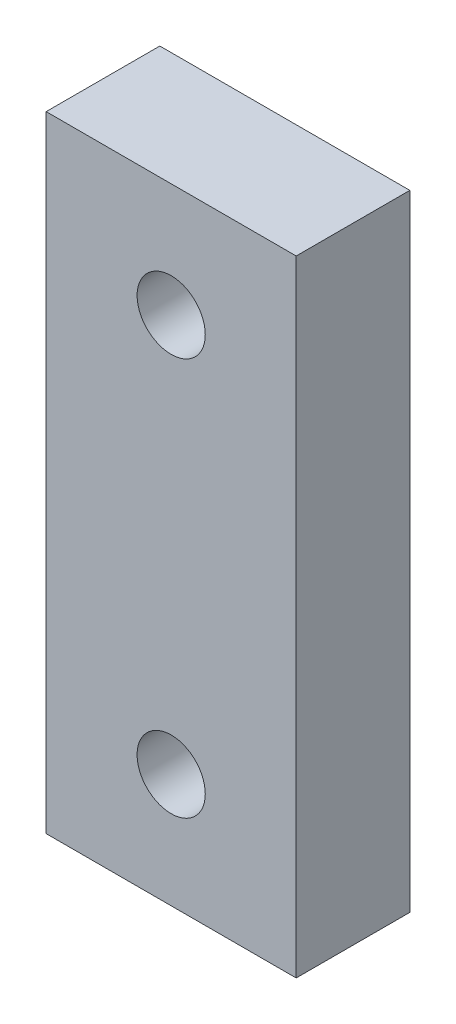
ISO-10303-21;
HEADER;
FILE_DESCRIPTION(('STEP AP214'),'2;1');
FILE_NAME('part.step','',(''),(''),'','','');
FILE_SCHEMA(('AUTOMOTIVE_DESIGN { 1 0 10303 214 1 1 1 1 }'));
ENDSEC;
DATA;
#1=APPLICATION_CONTEXT('core data for automotive mechanical design processes');
#2=APPLICATION_PROTOCOL_DEFINITION('international standard','automotive_design',2000,#1);
#3=PRODUCT_CONTEXT('',#1,'mechanical');
#4=PRODUCT('Part','Part','',(#3));
#5=PRODUCT_RELATED_PRODUCT_CATEGORY('part','',(#4));
#6=PRODUCT_DEFINITION_FORMATION('','',#4);
#7=PRODUCT_DEFINITION_CONTEXT('part definition',#1,'design');
#8=PRODUCT_DEFINITION('design','',#6,#7);
#9=PRODUCT_DEFINITION_SHAPE('','',#8);
#10=(LENGTH_UNIT() NAMED_UNIT(*) SI_UNIT(.MILLI.,.METRE.));
#11=(NAMED_UNIT(*) PLANE_ANGLE_UNIT() SI_UNIT($,.RADIAN.));
#12=(NAMED_UNIT(*) SI_UNIT($,.STERADIAN.) SOLID_ANGLE_UNIT());
#13=UNCERTAINTY_MEASURE_WITH_UNIT(LENGTH_MEASURE(1.E-05),#10,'distance_accuracy_value','');
#14=(GEOMETRIC_REPRESENTATION_CONTEXT(3) GLOBAL_UNCERTAINTY_ASSIGNED_CONTEXT((#13)) GLOBAL_UNIT_ASSIGNED_CONTEXT((#10,
#11,#12)) REPRESENTATION_CONTEXT('',''));
#15=CARTESIAN_POINT('',(0.,0.,0.));
#16=DIRECTION('',(0.,0.,1.));
#17=DIRECTION('',(1.,0.,0.));
#18=AXIS2_PLACEMENT_3D('',#15,#16,#17);
#19=CARTESIAN_POINT('',(5.5,13.755,5.));
#20=DIRECTION('',(-1.,0.,0.));
#21=DIRECTION('',(0.,-1.,0.));
#22=AXIS2_PLACEMENT_3D('',#19,#20,#21);
#23=PLANE('',#22);
#24=DIRECTION('',(0.,1.,0.));
#25=VECTOR('',#24,1.);
#26=CARTESIAN_POINT('',(5.5,13.755,0.));
#27=LINE('',#26,#25);
#28=CARTESIAN_POINT('',(5.5,-13.755,0.));
#29=VERTEX_POINT('',#28);
#30=CARTESIAN_POINT('',(5.5,13.755,0.));
#31=VERTEX_POINT('',#30);
#32=EDGE_CURVE('E96',#29,#31,#27,.T.);
#33=ORIENTED_EDGE('',*,*,#32,.T.);
#34=DIRECTION('',(0.,0.,-1.));
#35=VECTOR('',#34,1.);
#36=CARTESIAN_POINT('',(5.5,13.755,5.));
#37=LINE('',#36,#35);
#38=CARTESIAN_POINT('',(5.5,13.755,5.));
#39=VERTEX_POINT('',#38);
#40=EDGE_CURVE('E11',#39,#31,#37,.T.);
#41=ORIENTED_EDGE('',*,*,#40,.F.);
#42=DIRECTION('',(0.,1.,0.));
#43=VECTOR('',#42,1.);
#44=CARTESIAN_POINT('',(5.5,13.755,5.));
#45=LINE('',#44,#43);
#46=CARTESIAN_POINT('',(5.5,-13.755,5.));
#47=VERTEX_POINT('',#46);
#48=EDGE_CURVE('E84',#47,#39,#45,.T.);
#49=ORIENTED_EDGE('',*,*,#48,.F.);
#50=DIRECTION('',(0.,0.,-1.));
#51=VECTOR('',#50,1.);
#52=CARTESIAN_POINT('',(5.5,-13.755,5.));
#53=LINE('',#52,#51);
#54=EDGE_CURVE('E92',#47,#29,#53,.T.);
#55=ORIENTED_EDGE('',*,*,#54,.T.);
#56=EDGE_LOOP('',(#33,#41,#49,#55));
#57=FACE_BOUND('',#56,.T.);
#58=ADVANCED_FACE('F33',(#57),#23,.F.);
#59=CARTESIAN_POINT('',(-5.5,13.755,5.));
#60=DIRECTION('',(0.,-1.,0.));
#61=DIRECTION('',(0.,0.,-1.));
#62=AXIS2_PLACEMENT_3D('',#59,#60,#61);
#63=PLANE('',#62);
#64=DIRECTION('',(-1.,0.,0.));
#65=VECTOR('',#64,1.);
#66=CARTESIAN_POINT('',(-5.5,13.755,0.));
#67=LINE('',#66,#65);
#68=CARTESIAN_POINT('',(-5.5,13.755,0.));
#69=VERTEX_POINT('',#68);
#70=EDGE_CURVE('E88',#31,#69,#67,.T.);
#71=ORIENTED_EDGE('',*,*,#70,.T.);
#72=DIRECTION('',(0.,0.,-1.));
#73=VECTOR('',#72,1.);
#74=CARTESIAN_POINT('',(-5.5,13.755,5.));
#75=LINE('',#74,#73);
#76=CARTESIAN_POINT('',(-5.5,13.755,5.));
#77=VERTEX_POINT('',#76);
#78=EDGE_CURVE('E41',#77,#69,#75,.T.);
#79=ORIENTED_EDGE('',*,*,#78,.F.);
#80=DIRECTION('',(-1.,0.,0.));
#81=VECTOR('',#80,1.);
#82=CARTESIAN_POINT('',(-5.5,13.755,5.));
#83=LINE('',#82,#81);
#84=EDGE_CURVE('E79',#39,#77,#83,.T.);
#85=ORIENTED_EDGE('',*,*,#84,.F.);
#86=ORIENTED_EDGE('',*,*,#40,.T.);
#87=EDGE_LOOP('',(#71,#79,#85,#86));
#88=FACE_BOUND('',#87,.T.);
#89=ADVANCED_FACE('F87',(#88),#63,.F.);
#90=CARTESIAN_POINT('',(-5.5,13.755,5.));
#91=DIRECTION('',(1.,0.,0.));
#92=DIRECTION('',(0.,1.,0.));
#93=AXIS2_PLACEMENT_3D('',#90,#91,#92);
#94=PLANE('',#93);
#95=DIRECTION('',(0.,-1.,0.));
#96=VECTOR('',#95,1.);
#97=CARTESIAN_POINT('',(-5.5,13.755,0.));
#98=LINE('',#97,#96);
#99=CARTESIAN_POINT('',(-5.5,-13.755,0.));
#100=VERTEX_POINT('',#99);
#101=EDGE_CURVE('E66',#69,#100,#98,.T.);
#102=ORIENTED_EDGE('',*,*,#101,.T.);
#103=DIRECTION('',(0.,0.,-1.));
#104=VECTOR('',#103,1.);
#105=CARTESIAN_POINT('',(-5.5,-13.755,5.));
#106=LINE('',#105,#104);
#107=CARTESIAN_POINT('',(-5.5,-13.755,5.));
#108=VERTEX_POINT('',#107);
#109=EDGE_CURVE('E89',#108,#100,#106,.T.);
#110=ORIENTED_EDGE('',*,*,#109,.F.);
#111=DIRECTION('',(0.,-1.,0.));
#112=VECTOR('',#111,1.);
#113=CARTESIAN_POINT('',(-5.5,13.755,5.));
#114=LINE('',#113,#112);
#115=EDGE_CURVE('E82',#77,#108,#114,.T.);
#116=ORIENTED_EDGE('',*,*,#115,.F.);
#117=ORIENTED_EDGE('',*,*,#78,.T.);
#118=EDGE_LOOP('',(#102,#110,#116,#117));
#119=FACE_BOUND('',#118,.T.);
#120=ADVANCED_FACE('F90',(#119),#94,.F.);
#121=CARTESIAN_POINT('',(-5.5,-13.755,5.));
#122=DIRECTION('',(0.,1.,0.));
#123=DIRECTION('',(0.,0.,1.));
#124=AXIS2_PLACEMENT_3D('',#121,#122,#123);
#125=PLANE('',#124);
#126=DIRECTION('',(1.,0.,0.));
#127=VECTOR('',#126,1.);
#128=CARTESIAN_POINT('',(-5.5,-13.755,0.));
#129=LINE('',#128,#127);
#130=EDGE_CURVE('E72',#100,#29,#129,.T.);
#131=ORIENTED_EDGE('',*,*,#130,.T.);
#132=ORIENTED_EDGE('',*,*,#54,.F.);
#133=DIRECTION('',(1.,0.,0.));
#134=VECTOR('',#133,1.);
#135=CARTESIAN_POINT('',(-5.5,-13.755,5.));
#136=LINE('',#135,#134);
#137=EDGE_CURVE('E49',#108,#47,#136,.T.);
#138=ORIENTED_EDGE('',*,*,#137,.F.);
#139=ORIENTED_EDGE('',*,*,#109,.T.);
#140=EDGE_LOOP('',(#131,#132,#138,#139));
#141=FACE_BOUND('',#140,.T.);
#142=ADVANCED_FACE('F104',(#141),#125,.F.);
#143=CARTESIAN_POINT('',(0.,0.,5.));
#144=DIRECTION('',(0.,0.,1.));
#145=DIRECTION('',(1.,0.,0.));
#146=AXIS2_PLACEMENT_3D('',#143,#144,#145);
#147=PLANE('',#146);
#148=CARTESIAN_POINT('',(0.,8.755,5.));
#149=DIRECTION('',(0.,0.,1.));
#150=DIRECTION('',(1.,0.,0.));
#151=AXIS2_PLACEMENT_3D('',#148,#149,#150);
#152=CIRCLE('',#151,1.5);
#153=CARTESIAN_POINT('',(1.5,8.755,5.));
#154=VERTEX_POINT('',#153);
#155=EDGE_CURVE('E99',#154,#154,#152,.T.);
#156=ORIENTED_EDGE('',*,*,#155,.F.);
#157=EDGE_LOOP('',(#156));
#158=FACE_BOUND('',#157,.T.);
#159=CARTESIAN_POINT('',(0.,-8.745,5.));
#160=DIRECTION('',(0.,0.,1.));
#161=DIRECTION('',(1.,0.,0.));
#162=AXIS2_PLACEMENT_3D('',#159,#160,#161);
#163=CIRCLE('',#162,1.5);
#164=CARTESIAN_POINT('',(1.5,-8.745,5.));
#165=VERTEX_POINT('',#164);
#166=EDGE_CURVE('E112',#165,#165,#163,.T.);
#167=ORIENTED_EDGE('',*,*,#166,.F.);
#168=EDGE_LOOP('',(#167));
#169=FACE_BOUND('',#168,.T.);
#170=ORIENTED_EDGE('',*,*,#48,.T.);
#171=ORIENTED_EDGE('',*,*,#84,.T.);
#172=ORIENTED_EDGE('',*,*,#115,.T.);
#173=ORIENTED_EDGE('',*,*,#137,.T.);
#174=EDGE_LOOP('',(#170,#171,#172,#173));
#175=FACE_BOUND('',#174,.T.);
#176=ADVANCED_FACE('F80',(#158,#169,#175),#147,.T.);
#177=CARTESIAN_POINT('',(0.,0.,0.));
#178=DIRECTION('',(0.,0.,1.));
#179=DIRECTION('',(1.,0.,0.));
#180=AXIS2_PLACEMENT_3D('',#177,#178,#179);
#181=PLANE('',#180);
#182=CARTESIAN_POINT('',(0.,8.755,0.));
#183=DIRECTION('',(0.,0.,-1.));
#184=DIRECTION('',(-1.,0.,0.));
#185=AXIS2_PLACEMENT_3D('',#182,#183,#184);
#186=CIRCLE('',#185,1.5);
#187=CARTESIAN_POINT('',(-1.5,8.755,0.));
#188=VERTEX_POINT('',#187);
#189=EDGE_CURVE('E115',#188,#188,#186,.T.);
#190=ORIENTED_EDGE('',*,*,#189,.F.);
#191=EDGE_LOOP('',(#190));
#192=FACE_BOUND('',#191,.T.);
#193=CARTESIAN_POINT('',(0.,-8.745,0.));
#194=DIRECTION('',(0.,0.,-1.));
#195=DIRECTION('',(-1.,0.,0.));
#196=AXIS2_PLACEMENT_3D('',#193,#194,#195);
#197=CIRCLE('',#196,1.5);
#198=CARTESIAN_POINT('',(-1.5,-8.745,0.));
#199=VERTEX_POINT('',#198);
#200=EDGE_CURVE('E116',#199,#199,#197,.T.);
#201=ORIENTED_EDGE('',*,*,#200,.F.);
#202=EDGE_LOOP('',(#201));
#203=FACE_BOUND('',#202,.T.);
#204=ORIENTED_EDGE('',*,*,#32,.F.);
#205=ORIENTED_EDGE('',*,*,#130,.F.);
#206=ORIENTED_EDGE('',*,*,#101,.F.);
#207=ORIENTED_EDGE('',*,*,#70,.F.);
#208=EDGE_LOOP('',(#204,#205,#206,#207));
#209=FACE_BOUND('',#208,.T.);
#210=ADVANCED_FACE('F107',(#192,#203,#209),#181,.F.);
#211=CARTESIAN_POINT('',(0.,-8.745,50.));
#212=DIRECTION('',(0.,0.,-1.));
#213=DIRECTION('',(-1.,0.,0.));
#214=AXIS2_PLACEMENT_3D('',#211,#212,#213);
#215=CYLINDRICAL_SURFACE('',#214,1.5);
#216=ORIENTED_EDGE('',*,*,#166,.T.);
#217=EDGE_LOOP('',(#216));
#218=FACE_BOUND('',#217,.T.);
#219=ORIENTED_EDGE('',*,*,#200,.T.);
#220=EDGE_LOOP('',(#219));
#221=FACE_BOUND('',#220,.T.);
#222=ADVANCED_FACE('F126',(#218,#221),#215,.F.);
#223=CARTESIAN_POINT('',(0.,8.755,50.));
#224=DIRECTION('',(0.,0.,-1.));
#225=DIRECTION('',(-1.,0.,0.));
#226=AXIS2_PLACEMENT_3D('',#223,#224,#225);
#227=CYLINDRICAL_SURFACE('',#226,1.5);
#228=ORIENTED_EDGE('',*,*,#155,.T.);
#229=EDGE_LOOP('',(#228));
#230=FACE_BOUND('',#229,.T.);
#231=ORIENTED_EDGE('',*,*,#189,.T.);
#232=EDGE_LOOP('',(#231));
#233=FACE_BOUND('',#232,.T.);
#234=ADVANCED_FACE('F122',(#230,#233),#227,.F.);
#235=CLOSED_SHELL('',(#58,#89,#120,#142,#176,#210,#222,#234));
#236=MANIFOLD_SOLID_BREP('B2',#235);
#237=ADVANCED_BREP_SHAPE_REPRESENTATION('',(#18,#236),#14);
#238=SHAPE_DEFINITION_REPRESENTATION(#9,#237);
ENDSEC;
END-ISO-10303-21;
